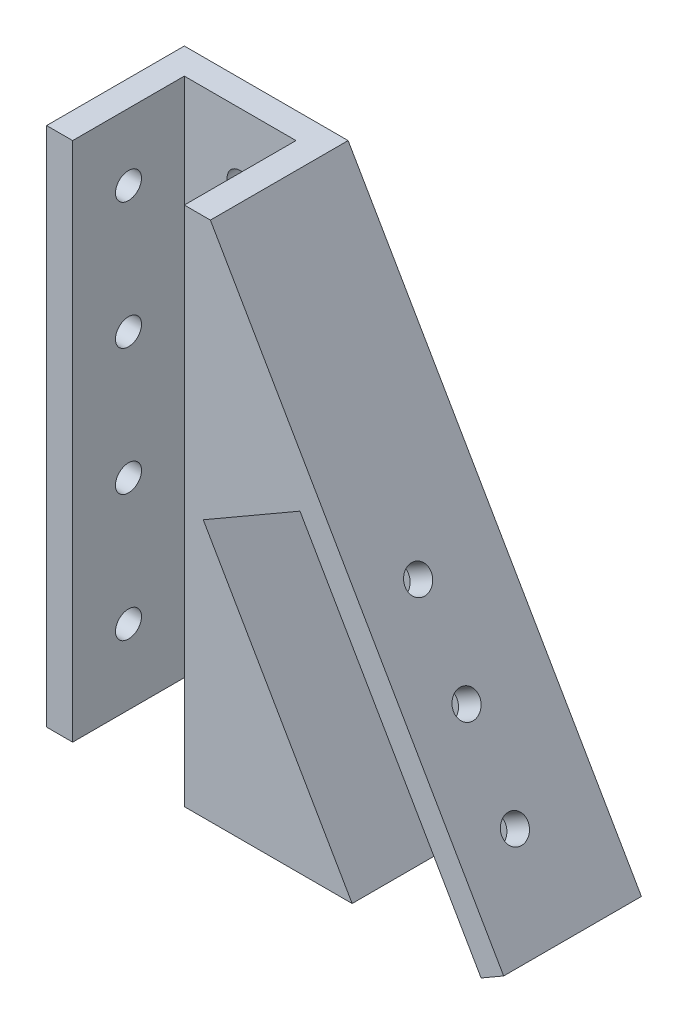
ISO-10303-21;
HEADER;
FILE_DESCRIPTION(('STEP AP214'),'2;1');
FILE_NAME('part.step','',(''),(''),'','','');
FILE_SCHEMA(('AUTOMOTIVE_DESIGN { 1 0 10303 214 1 1 1 1 }'));
ENDSEC;
DATA;
#1=APPLICATION_CONTEXT('core data for automotive mechanical design processes');
#2=APPLICATION_PROTOCOL_DEFINITION('international standard','automotive_design',2000,#1);
#3=PRODUCT_CONTEXT('',#1,'mechanical');
#4=PRODUCT('Part','Part','',(#3));
#5=PRODUCT_RELATED_PRODUCT_CATEGORY('part','',(#4));
#6=PRODUCT_DEFINITION_FORMATION('','',#4);
#7=PRODUCT_DEFINITION_CONTEXT('part definition',#1,'design');
#8=PRODUCT_DEFINITION('design','',#6,#7);
#9=PRODUCT_DEFINITION_SHAPE('','',#8);
#10=(LENGTH_UNIT() NAMED_UNIT(*) SI_UNIT(.MILLI.,.METRE.));
#11=(NAMED_UNIT(*) PLANE_ANGLE_UNIT() SI_UNIT($,.RADIAN.));
#12=(NAMED_UNIT(*) SI_UNIT($,.STERADIAN.) SOLID_ANGLE_UNIT());
#13=UNCERTAINTY_MEASURE_WITH_UNIT(LENGTH_MEASURE(1.E-05),#10,'distance_accuracy_value','');
#14=(GEOMETRIC_REPRESENTATION_CONTEXT(3) GLOBAL_UNCERTAINTY_ASSIGNED_CONTEXT((#13)) GLOBAL_UNIT_ASSIGNED_CONTEXT((#10,
#11,#12)) REPRESENTATION_CONTEXT('',''));
#15=CARTESIAN_POINT('',(0.,0.,0.));
#16=DIRECTION('',(0.,0.,1.));
#17=DIRECTION('',(1.,0.,0.));
#18=AXIS2_PLACEMENT_3D('',#15,#16,#17);
#19=CARTESIAN_POINT('',(0.,0.,18.5));
#20=DIRECTION('',(0.,0.,1.));
#21=DIRECTION('',(1.,0.,0.));
#22=AXIS2_PLACEMENT_3D('',#19,#20,#21);
#23=PLANE('',#22);
#24=DIRECTION('',(0.,-1.,0.));
#25=VECTOR('',#24,1.);
#26=CARTESIAN_POINT('',(-10.6450100198623,37.4695571024635,18.5));
#27=LINE('',#26,#25);
#28=CARTESIAN_POINT('',(-10.6450100198623,37.4695571024635,18.5));
#29=VERTEX_POINT('',#28);
#30=CARTESIAN_POINT('',(-10.6450100198623,-32.5112050110695,18.5));
#31=VERTEX_POINT('',#30);
#32=EDGE_CURVE('E284',#29,#31,#27,.T.);
#33=ORIENTED_EDGE('',*,*,#32,.F.);
#34=DIRECTION('',(-1.,0.,0.));
#35=VECTOR('',#34,1.);
#36=CARTESIAN_POINT('',(-14.1450100198623,37.4695571024635,18.5));
#37=LINE('',#36,#35);
#38=CARTESIAN_POINT('',(-14.1450100198623,37.4695571024635,18.5));
#39=VERTEX_POINT('',#38);
#40=EDGE_CURVE('E148',#29,#39,#37,.T.);
#41=ORIENTED_EDGE('',*,*,#40,.T.);
#42=DIRECTION('',(0.,-1.,0.));
#43=VECTOR('',#42,1.);
#44=CARTESIAN_POINT('',(-14.1450100198623,37.4695571024635,18.5));
#45=LINE('',#44,#43);
#46=CARTESIAN_POINT('',(-14.1450100198623,-32.5112050110695,18.5));
#47=VERTEX_POINT('',#46);
#48=EDGE_CURVE('E170',#39,#47,#45,.T.);
#49=ORIENTED_EDGE('',*,*,#48,.T.);
#50=DIRECTION('',(1.,0.,0.));
#51=VECTOR('',#50,1.);
#52=CARTESIAN_POINT('',(-14.1450100198623,-32.5112050110695,18.5));
#53=LINE('',#52,#51);
#54=EDGE_CURVE('E149',#47,#31,#53,.T.);
#55=ORIENTED_EDGE('',*,*,#54,.T.);
#56=EDGE_LOOP('',(#33,#41,#49,#55));
#57=FACE_BOUND('',#56,.T.);
#58=ADVANCED_FACE('F34',(#57),#23,.T.);
#59=CARTESIAN_POINT('',(-14.1450100198623,37.4695571024635,18.5));
#60=DIRECTION('',(1.,0.,0.));
#61=DIRECTION('',(0.,1.,0.));
#62=AXIS2_PLACEMENT_3D('',#59,#60,#61);
#63=PLANE('',#62);
#64=CARTESIAN_POINT('',(-14.1450100198623,28.4887949889305,11.));
#65=DIRECTION('',(-1.,0.,0.));
#66=DIRECTION('',(0.,-1.,0.));
#67=AXIS2_PLACEMENT_3D('',#64,#65,#66);
#68=CIRCLE('',#67,1.75);
#69=CARTESIAN_POINT('',(-14.1450100198623,26.7387949889305,11.));
#70=VERTEX_POINT('',#69);
#71=EDGE_CURVE('E222',#70,#70,#68,.T.);
#72=ORIENTED_EDGE('',*,*,#71,.F.);
#73=EDGE_LOOP('',(#72));
#74=FACE_BOUND('',#73,.T.);
#75=CARTESIAN_POINT('',(-14.1450100198623,11.4887949889305,11.));
#76=DIRECTION('',(-1.,0.,0.));
#77=DIRECTION('',(0.,-1.,0.));
#78=AXIS2_PLACEMENT_3D('',#75,#76,#77);
#79=CIRCLE('',#78,1.75);
#80=CARTESIAN_POINT('',(-14.1450100198623,9.73879498893051,11.));
#81=VERTEX_POINT('',#80);
#82=EDGE_CURVE('E212',#81,#81,#79,.T.);
#83=ORIENTED_EDGE('',*,*,#82,.F.);
#84=EDGE_LOOP('',(#83));
#85=FACE_BOUND('',#84,.T.);
#86=CARTESIAN_POINT('',(-14.1450100198623,-5.51120501106949,11.));
#87=DIRECTION('',(-1.,0.,0.));
#88=DIRECTION('',(0.,-1.,0.));
#89=AXIS2_PLACEMENT_3D('',#86,#87,#88);
#90=CIRCLE('',#89,1.75);
#91=CARTESIAN_POINT('',(-14.1450100198623,-7.26120501106949,11.));
#92=VERTEX_POINT('',#91);
#93=EDGE_CURVE('E209',#92,#92,#90,.T.);
#94=ORIENTED_EDGE('',*,*,#93,.F.);
#95=EDGE_LOOP('',(#94));
#96=FACE_BOUND('',#95,.T.);
#97=CARTESIAN_POINT('',(-14.1450100198623,-22.5112050110695,11.));
#98=DIRECTION('',(-1.,0.,0.));
#99=DIRECTION('',(0.,-1.,0.));
#100=AXIS2_PLACEMENT_3D('',#97,#98,#99);
#101=CIRCLE('',#100,1.75);
#102=CARTESIAN_POINT('',(-14.1450100198623,-24.2612050110695,11.));
#103=VERTEX_POINT('',#102);
#104=EDGE_CURVE('E206',#103,#103,#101,.T.);
#105=ORIENTED_EDGE('',*,*,#104,.F.);
#106=EDGE_LOOP('',(#105));
#107=FACE_BOUND('',#106,.T.);
#108=DIRECTION('',(0.,-1.,0.));
#109=VECTOR('',#108,1.);
#110=CARTESIAN_POINT('',(-14.1450100198623,37.4695571024635,0.));
#111=LINE('',#110,#109);
#112=CARTESIAN_POINT('',(-14.1450100198623,37.4695571024635,0.));
#113=VERTEX_POINT('',#112);
#114=CARTESIAN_POINT('',(-14.1450100198623,-32.5112050110695,0.));
#115=VERTEX_POINT('',#114);
#116=EDGE_CURVE('E159',#113,#115,#111,.T.);
#117=ORIENTED_EDGE('',*,*,#116,.T.);
#118=DIRECTION('',(0.,0.,-1.));
#119=VECTOR('',#118,1.);
#120=CARTESIAN_POINT('',(-14.1450100198623,-32.5112050110695,18.5));
#121=LINE('',#120,#119);
#122=EDGE_CURVE('E12',#47,#115,#121,.T.);
#123=ORIENTED_EDGE('',*,*,#122,.F.);
#124=ORIENTED_EDGE('',*,*,#48,.F.);
#125=DIRECTION('',(0.,0.,-1.));
#126=VECTOR('',#125,1.);
#127=CARTESIAN_POINT('',(-14.1450100198623,37.4695571024635,18.5));
#128=LINE('',#127,#126);
#129=EDGE_CURVE('E158',#39,#113,#128,.T.);
#130=ORIENTED_EDGE('',*,*,#129,.T.);
#131=EDGE_LOOP('',(#117,#123,#124,#130));
#132=FACE_BOUND('',#131,.T.);
#133=ADVANCED_FACE('F36',(#74,#85,#96,#107,#132),#63,.F.);
#134=CARTESIAN_POINT('',(48.2584018244813,-32.5112050110695,18.5));
#135=DIRECTION('',(0.,1.,0.));
#136=DIRECTION('',(-1.,0.,0.));
#137=AXIS2_PLACEMENT_3D('',#134,#135,#136);
#138=PLANE('',#137);
#139=DIRECTION('',(1.,0.,0.));
#140=VECTOR('',#139,1.);
#141=CARTESIAN_POINT('',(48.2584018244813,-32.5112050110695,0.));
#142=LINE('',#141,#140);
#143=CARTESIAN_POINT('',(44.2169499401539,-32.5112050110695,0.));
#144=VERTEX_POINT('',#143);
#145=EDGE_CURVE('E162',#115,#144,#142,.T.);
#146=ORIENTED_EDGE('',*,*,#145,.T.);
#147=DIRECTION('',(0.,0.,1.));
#148=VECTOR('',#147,1.);
#149=CARTESIAN_POINT('',(44.2169499401539,-32.5112050110695,-0.500000000000004));
#150=LINE('',#149,#148);
#151=CARTESIAN_POINT('',(44.2169499401539,-32.5112050110695,3.5));
#152=VERTEX_POINT('',#151);
#153=EDGE_CURVE('E133',#144,#152,#150,.T.);
#154=ORIENTED_EDGE('',*,*,#153,.T.);
#155=DIRECTION('',(-1.,0.,0.));
#156=VECTOR('',#155,1.);
#157=CARTESIAN_POINT('',(26.8964418644652,-32.5112050110695,3.5));
#158=LINE('',#157,#156);
#159=CARTESIAN_POINT('',(26.8964418644652,-32.5112050110695,3.5));
#160=VERTEX_POINT('',#159);
#161=EDGE_CURVE('E264',#152,#160,#158,.T.);
#162=ORIENTED_EDGE('',*,*,#161,.T.);
#163=DIRECTION('',(0.,0.,1.));
#164=VECTOR('',#163,1.);
#165=CARTESIAN_POINT('',(26.8964418644652,-32.5112050110695,-71.5702945780643));
#166=LINE('',#165,#164);
#167=CARTESIAN_POINT('',(26.8964418644652,-32.5112050110695,18.5));
#168=VERTEX_POINT('',#167);
#169=EDGE_CURVE('E262',#160,#168,#166,.T.);
#170=ORIENTED_EDGE('',*,*,#169,.T.);
#171=CARTESIAN_POINT('',(4.3549899801377,-32.5112050110695,18.5));
#172=VERTEX_POINT('',#171);
#173=EDGE_CURVE('E154',#172,#168,#53,.T.);
#174=ORIENTED_EDGE('',*,*,#173,.F.);
#175=DIRECTION('',(0.,0.,1.));
#176=VECTOR('',#175,1.);
#177=CARTESIAN_POINT('',(4.3549899801377,-32.5112050110695,-71.5702945780643));
#178=LINE('',#177,#176);
#179=CARTESIAN_POINT('',(4.3549899801377,-32.5112050110695,3.5));
#180=VERTEX_POINT('',#179);
#181=EDGE_CURVE('E59',#180,#172,#178,.T.);
#182=ORIENTED_EDGE('',*,*,#181,.F.);
#183=DIRECTION('',(-1.,0.,0.));
#184=VECTOR('',#183,1.);
#185=CARTESIAN_POINT('',(-10.6450100198623,-32.5112050110695,3.5));
#186=LINE('',#185,#184);
#187=CARTESIAN_POINT('',(-10.6450100198623,-32.5112050110695,3.5));
#188=VERTEX_POINT('',#187);
#189=EDGE_CURVE('E163',#180,#188,#186,.T.);
#190=ORIENTED_EDGE('',*,*,#189,.T.);
#191=DIRECTION('',(0.,0.,1.));
#192=VECTOR('',#191,1.);
#193=CARTESIAN_POINT('',(-10.6450100198623,-32.5112050110695,-71.5702945780643));
#194=LINE('',#193,#192);
#195=EDGE_CURVE('E296',#188,#31,#194,.T.);
#196=ORIENTED_EDGE('',*,*,#195,.T.);
#197=ORIENTED_EDGE('',*,*,#54,.F.);
#198=ORIENTED_EDGE('',*,*,#122,.T.);
#199=EDGE_LOOP('',(#146,#154,#162,#170,#174,#182,#190,#196,#197,#198));
#200=FACE_BOUND('',#199,.T.);
#201=ADVANCED_FACE('F313',(#200),#138,.F.);
#202=CARTESIAN_POINT('',(7.85498998013769,37.4695571024635,18.5));
#203=DIRECTION('',(-0.866025403784438,-0.500000000000002,0.));
#204=DIRECTION('',(0.500000000000002,-0.866025403784438,0.));
#205=AXIS2_PLACEMENT_3D('',#202,#203,#204);
#206=PLANE('',#205);
#207=CARTESIAN_POINT('',(28.2584018244813,2.12981114030803,11.));
#208=DIRECTION('',(0.866025403784438,0.500000000000002,0.));
#209=DIRECTION('',(-0.500000000000002,0.866025403784438,0.));
#210=AXIS2_PLACEMENT_3D('',#207,#208,#209);
#211=CIRCLE('',#210,1.75);
#212=CARTESIAN_POINT('',(27.3834018244813,3.64535559693079,11.));
#213=VERTEX_POINT('',#212);
#214=EDGE_CURVE('E177',#213,#213,#211,.T.);
#215=ORIENTED_EDGE('',*,*,#214,.F.);
#216=EDGE_LOOP('',(#215));
#217=FACE_BOUND('',#216,.T.);
#218=CARTESIAN_POINT('',(34.7584018244813,-9.12851910888966,11.));
#219=DIRECTION('',(0.866025403784438,0.500000000000002,0.));
#220=DIRECTION('',(-0.500000000000002,0.866025403784438,0.));
#221=AXIS2_PLACEMENT_3D('',#218,#219,#220);
#222=CIRCLE('',#221,1.75);
#223=CARTESIAN_POINT('',(33.8834018244813,-7.6129746522669,11.));
#224=VERTEX_POINT('',#223);
#225=EDGE_CURVE('E245',#224,#224,#222,.T.);
#226=ORIENTED_EDGE('',*,*,#225,.F.);
#227=EDGE_LOOP('',(#226));
#228=FACE_BOUND('',#227,.T.);
#229=CARTESIAN_POINT('',(41.2584018244813,-20.3868493580874,11.));
#230=DIRECTION('',(0.866025403784438,0.500000000000002,0.));
#231=DIRECTION('',(-0.500000000000002,0.866025403784438,0.));
#232=AXIS2_PLACEMENT_3D('',#229,#230,#231);
#233=CIRCLE('',#232,1.75);
#234=CARTESIAN_POINT('',(40.3834018244813,-18.8713049014646,11.));
#235=VERTEX_POINT('',#234);
#236=EDGE_CURVE('E251',#235,#235,#233,.T.);
#237=ORIENTED_EDGE('',*,*,#236,.F.);
#238=EDGE_LOOP('',(#237));
#239=FACE_BOUND('',#238,.T.);
#240=DIRECTION('',(-0.500000000000002,0.866025403784438,0.));
#241=VECTOR('',#240,1.);
#242=CARTESIAN_POINT('',(7.85498998013769,37.4695571024635,18.5));
#243=LINE('',#242,#241);
#244=CARTESIAN_POINT('',(47.2480388533995,-30.7612050110695,18.5));
#245=VERTEX_POINT('',#244);
#246=CARTESIAN_POINT('',(7.85498998013769,37.4695571024635,18.5));
#247=VERTEX_POINT('',#246);
#248=EDGE_CURVE('E139',#245,#247,#243,.T.);
#249=ORIENTED_EDGE('',*,*,#248,.F.);
#250=DIRECTION('',(0.,0.,1.));
#251=VECTOR('',#250,1.);
#252=CARTESIAN_POINT('',(47.2480388533995,-30.7612050110695,-0.500000000000004));
#253=LINE('',#252,#251);
#254=CARTESIAN_POINT('',(47.2480388533995,-30.7612050110695,0.));
#255=VERTEX_POINT('',#254);
#256=EDGE_CURVE('E126',#255,#245,#253,.T.);
#257=ORIENTED_EDGE('',*,*,#256,.F.);
#258=DIRECTION('',(-0.500000000000002,0.866025403784438,0.));
#259=VECTOR('',#258,1.);
#260=CARTESIAN_POINT('',(7.85498998013769,37.4695571024635,0.));
#261=LINE('',#260,#259);
#262=CARTESIAN_POINT('',(7.85498998013769,37.4695571024635,0.));
#263=VERTEX_POINT('',#262);
#264=EDGE_CURVE('E166',#255,#263,#261,.T.);
#265=ORIENTED_EDGE('',*,*,#264,.T.);
#266=DIRECTION('',(0.,0.,-1.));
#267=VECTOR('',#266,1.);
#268=CARTESIAN_POINT('',(7.85498998013769,37.4695571024635,18.5));
#269=LINE('',#268,#267);
#270=EDGE_CURVE('E43',#247,#263,#269,.T.);
#271=ORIENTED_EDGE('',*,*,#270,.F.);
#272=EDGE_LOOP('',(#249,#257,#265,#271));
#273=FACE_BOUND('',#272,.T.);
#274=ADVANCED_FACE('F145',(#217,#228,#239,#273),#206,.F.);
#275=CARTESIAN_POINT('',(-14.1450100198623,37.4695571024635,18.5));
#276=DIRECTION('',(0.,-1.,0.));
#277=DIRECTION('',(0.,0.,-1.));
#278=AXIS2_PLACEMENT_3D('',#275,#276,#277);
#279=PLANE('',#278);
#280=ORIENTED_EDGE('',*,*,#40,.F.);
#281=DIRECTION('',(0.,0.,1.));
#282=VECTOR('',#281,1.);
#283=CARTESIAN_POINT('',(-10.6450100198623,37.4695571024635,-71.5702945780643));
#284=LINE('',#283,#282);
#285=CARTESIAN_POINT('',(-10.6450100198623,37.4695571024635,3.5));
#286=VERTEX_POINT('',#285);
#287=EDGE_CURVE('E288',#286,#29,#284,.T.);
#288=ORIENTED_EDGE('',*,*,#287,.F.);
#289=DIRECTION('',(1.,0.,0.));
#290=VECTOR('',#289,1.);
#291=CARTESIAN_POINT('',(-10.6450100198623,37.4695571024635,3.5));
#292=LINE('',#291,#290);
#293=CARTESIAN_POINT('',(4.35498998013769,37.4695571024635,3.5));
#294=VERTEX_POINT('',#293);
#295=EDGE_CURVE('E287',#286,#294,#292,.T.);
#296=ORIENTED_EDGE('',*,*,#295,.T.);
#297=DIRECTION('',(0.,0.,1.));
#298=VECTOR('',#297,1.);
#299=CARTESIAN_POINT('',(4.35498998013769,37.4695571024635,-71.5702945780643));
#300=LINE('',#299,#298);
#301=CARTESIAN_POINT('',(4.35498998013769,37.4695571024635,18.5));
#302=VERTEX_POINT('',#301);
#303=EDGE_CURVE('E298',#294,#302,#300,.T.);
#304=ORIENTED_EDGE('',*,*,#303,.T.);
#305=EDGE_CURVE('E151',#247,#302,#37,.T.);
#306=ORIENTED_EDGE('',*,*,#305,.F.);
#307=ORIENTED_EDGE('',*,*,#270,.T.);
#308=DIRECTION('',(-1.,0.,0.));
#309=VECTOR('',#308,1.);
#310=CARTESIAN_POINT('',(-14.1450100198623,37.4695571024635,0.));
#311=LINE('',#310,#309);
#312=EDGE_CURVE('E168',#263,#113,#311,.T.);
#313=ORIENTED_EDGE('',*,*,#312,.T.);
#314=ORIENTED_EDGE('',*,*,#129,.F.);
#315=EDGE_LOOP('',(#280,#288,#296,#304,#306,#307,#313,#314));
#316=FACE_BOUND('',#315,.T.);
#317=ADVANCED_FACE('F352',(#316),#279,.F.);
#318=DIRECTION('',(-0.866025403784438,-0.5,0.));
#319=VECTOR('',#318,1.);
#320=CARTESIAN_POINT('',(44.2169499401539,-32.5112050110695,18.5));
#321=LINE('',#320,#319);
#322=CARTESIAN_POINT('',(44.2169499401539,-32.5112050110695,18.5));
#323=VERTEX_POINT('',#322);
#324=EDGE_CURVE('E51',#245,#323,#321,.T.);
#325=ORIENTED_EDGE('',*,*,#324,.F.);
#326=ORIENTED_EDGE('',*,*,#248,.T.);
#327=ORIENTED_EDGE('',*,*,#305,.T.);
#328=DIRECTION('',(0.,1.,0.));
#329=VECTOR('',#328,1.);
#330=CARTESIAN_POINT('',(4.35498998013769,37.4695571024635,18.5));
#331=LINE('',#330,#329);
#332=EDGE_CURVE('E294',#172,#302,#331,.T.);
#333=ORIENTED_EDGE('',*,*,#332,.F.);
#334=ORIENTED_EDGE('',*,*,#173,.T.);
#335=DIRECTION('',(0.5,-0.866025403784438,0.));
#336=VECTOR('',#335,1.);
#337=CARTESIAN_POINT('',(6.89644186446516,2.12981114030804,18.5));
#338=LINE('',#337,#336);
#339=CARTESIAN_POINT('',(6.89644186446516,2.12981114030804,18.5));
#340=VERTEX_POINT('',#339);
#341=EDGE_CURVE('E272',#340,#168,#338,.T.);
#342=ORIENTED_EDGE('',*,*,#341,.F.);
#343=DIRECTION('',(-0.866025403784438,-0.5,0.));
#344=VECTOR('',#343,1.);
#345=CARTESIAN_POINT('',(19.8868229212317,9.62981114030804,18.5));
#346=LINE('',#345,#344);
#347=CARTESIAN_POINT('',(19.8868229212317,9.62981114030804,18.5));
#348=VERTEX_POINT('',#347);
#349=EDGE_CURVE('E269',#348,#340,#346,.T.);
#350=ORIENTED_EDGE('',*,*,#349,.F.);
#351=DIRECTION('',(-0.5,0.866025403784439,0.));
#352=VECTOR('',#351,1.);
#353=CARTESIAN_POINT('',(44.2169499401539,-32.5112050110695,18.5));
#354=LINE('',#353,#352);
#355=EDGE_CURVE('E143',#323,#348,#354,.T.);
#356=ORIENTED_EDGE('',*,*,#355,.F.);
#357=EDGE_LOOP('',(#325,#326,#327,#333,#334,#342,#350,#356));
#358=FACE_BOUND('',#357,.T.);
#359=ADVANCED_FACE('F137',(#358),#23,.T.);
#360=CARTESIAN_POINT('',(0.,0.,0.));
#361=DIRECTION('',(0.,0.,1.));
#362=DIRECTION('',(1.,0.,0.));
#363=AXIS2_PLACEMENT_3D('',#360,#361,#362);
#364=PLANE('',#363);
#365=CARTESIAN_POINT('',(-3.14501001986232,28.4887949889305,0.));
#366=DIRECTION('',(0.,0.,-1.));
#367=DIRECTION('',(-1.,0.,0.));
#368=AXIS2_PLACEMENT_3D('',#365,#366,#367);
#369=CIRCLE('',#368,1.75);
#370=CARTESIAN_POINT('',(-4.89501001986232,28.4887949889305,0.));
#371=VERTEX_POINT('',#370);
#372=EDGE_CURVE('E202',#371,#371,#369,.T.);
#373=ORIENTED_EDGE('',*,*,#372,.F.);
#374=EDGE_LOOP('',(#373));
#375=FACE_BOUND('',#374,.T.);
#376=CARTESIAN_POINT('',(-3.14501001986231,-22.5112050110695,0.));
#377=DIRECTION('',(0.,0.,-1.));
#378=DIRECTION('',(-1.,0.,0.));
#379=AXIS2_PLACEMENT_3D('',#376,#377,#378);
#380=CIRCLE('',#379,1.75);
#381=CARTESIAN_POINT('',(-4.89501001986231,-22.5112050110695,0.));
#382=VERTEX_POINT('',#381);
#383=EDGE_CURVE('E198',#382,#382,#380,.T.);
#384=ORIENTED_EDGE('',*,*,#383,.F.);
#385=EDGE_LOOP('',(#384));
#386=FACE_BOUND('',#385,.T.);
#387=CARTESIAN_POINT('',(-3.14501001986232,11.4887949889305,0.));
#388=DIRECTION('',(0.,0.,-1.));
#389=DIRECTION('',(-1.,0.,0.));
#390=AXIS2_PLACEMENT_3D('',#387,#388,#389);
#391=CIRCLE('',#390,1.75);
#392=CARTESIAN_POINT('',(-4.89501001986232,11.4887949889305,0.));
#393=VERTEX_POINT('',#392);
#394=EDGE_CURVE('E194',#393,#393,#391,.T.);
#395=ORIENTED_EDGE('',*,*,#394,.F.);
#396=EDGE_LOOP('',(#395));
#397=FACE_BOUND('',#396,.T.);
#398=CARTESIAN_POINT('',(-3.14501001986231,-5.51120501106949,0.));
#399=DIRECTION('',(0.,0.,-1.));
#400=DIRECTION('',(-1.,0.,0.));
#401=AXIS2_PLACEMENT_3D('',#398,#399,#400);
#402=CIRCLE('',#401,1.75);
#403=CARTESIAN_POINT('',(-4.89501001986232,-5.51120501106949,0.));
#404=VERTEX_POINT('',#403);
#405=EDGE_CURVE('E190',#404,#404,#402,.T.);
#406=ORIENTED_EDGE('',*,*,#405,.F.);
#407=EDGE_LOOP('',(#406));
#408=FACE_BOUND('',#407,.T.);
#409=CARTESIAN_POINT('',(17.5566959023095,-1.3342904748297,0.));
#410=DIRECTION('',(0.,0.,-1.));
#411=DIRECTION('',(-1.,0.,0.));
#412=AXIS2_PLACEMENT_3D('',#409,#410,#411);
#413=CIRCLE('',#412,1.75);
#414=CARTESIAN_POINT('',(15.8066959023095,-1.3342904748297,0.));
#415=VERTEX_POINT('',#414);
#416=EDGE_CURVE('E186',#415,#415,#413,.T.);
#417=ORIENTED_EDGE('',*,*,#416,.F.);
#418=EDGE_LOOP('',(#417));
#419=FACE_BOUND('',#418,.T.);
#420=CARTESIAN_POINT('',(24.0566959023096,-12.5926207240274,0.));
#421=DIRECTION('',(0.,0.,-1.));
#422=DIRECTION('',(-1.,0.,0.));
#423=AXIS2_PLACEMENT_3D('',#420,#421,#422);
#424=CIRCLE('',#423,1.75000000000002);
#425=CARTESIAN_POINT('',(22.3066959023095,-12.5926207240274,0.));
#426=VERTEX_POINT('',#425);
#427=EDGE_CURVE('E182',#426,#426,#424,.T.);
#428=ORIENTED_EDGE('',*,*,#427,.F.);
#429=EDGE_LOOP('',(#428));
#430=FACE_BOUND('',#429,.T.);
#431=CARTESIAN_POINT('',(30.5566959023095,-23.8509509732251,0.));
#432=DIRECTION('',(0.,0.,-1.));
#433=DIRECTION('',(-1.,0.,0.));
#434=AXIS2_PLACEMENT_3D('',#431,#432,#433);
#435=CIRCLE('',#434,1.75);
#436=CARTESIAN_POINT('',(28.8066959023095,-23.8509509732251,0.));
#437=VERTEX_POINT('',#436);
#438=EDGE_CURVE('E178',#437,#437,#435,.T.);
#439=ORIENTED_EDGE('',*,*,#438,.F.);
#440=EDGE_LOOP('',(#439));
#441=FACE_BOUND('',#440,.T.);
#442=ORIENTED_EDGE('',*,*,#264,.F.);
#443=DIRECTION('',(-0.866025403784439,-0.5,0.));
#444=VECTOR('',#443,1.);
#445=CARTESIAN_POINT('',(25.1320022086536,-43.5299047213212,0.));
#446=LINE('',#445,#444);
#447=EDGE_CURVE('E129',#255,#144,#446,.T.);
#448=ORIENTED_EDGE('',*,*,#447,.T.);
#449=ORIENTED_EDGE('',*,*,#145,.F.);
#450=ORIENTED_EDGE('',*,*,#116,.F.);
#451=ORIENTED_EDGE('',*,*,#312,.F.);
#452=EDGE_LOOP('',(#442,#448,#449,#450,#451));
#453=FACE_BOUND('',#452,.T.);
#454=ADVANCED_FACE('F345',(#375,#386,#397,#408,#419,#430,#441,#453),#364,.F.);
#455=CARTESIAN_POINT('',(-10.6450100198623,37.4695571024635,-71.5702945780643));
#456=DIRECTION('',(-1.,0.,0.));
#457=DIRECTION('',(0.,-1.,0.));
#458=AXIS2_PLACEMENT_3D('',#455,#456,#457);
#459=PLANE('',#458);
#460=CARTESIAN_POINT('',(-10.6450100198623,28.4887949889305,11.));
#461=DIRECTION('',(-1.,0.,0.));
#462=DIRECTION('',(0.,-1.,0.));
#463=AXIS2_PLACEMENT_3D('',#460,#461,#462);
#464=CIRCLE('',#463,1.75);
#465=CARTESIAN_POINT('',(-10.6450100198623,26.7387949889305,11.));
#466=VERTEX_POINT('',#465);
#467=EDGE_CURVE('E38',#466,#466,#464,.T.);
#468=ORIENTED_EDGE('',*,*,#467,.T.);
#469=EDGE_LOOP('',(#468));
#470=FACE_BOUND('',#469,.T.);
#471=CARTESIAN_POINT('',(-10.6450100198623,11.4887949889305,11.));
#472=DIRECTION('',(-1.,0.,0.));
#473=DIRECTION('',(0.,-1.,0.));
#474=AXIS2_PLACEMENT_3D('',#471,#472,#473);
#475=CIRCLE('',#474,1.75);
#476=CARTESIAN_POINT('',(-10.6450100198623,9.73879498893051,11.));
#477=VERTEX_POINT('',#476);
#478=EDGE_CURVE('E210',#477,#477,#475,.T.);
#479=ORIENTED_EDGE('',*,*,#478,.T.);
#480=EDGE_LOOP('',(#479));
#481=FACE_BOUND('',#480,.T.);
#482=CARTESIAN_POINT('',(-10.6450100198623,-5.51120501106949,11.));
#483=DIRECTION('',(-1.,0.,0.));
#484=DIRECTION('',(0.,-1.,0.));
#485=AXIS2_PLACEMENT_3D('',#482,#483,#484);
#486=CIRCLE('',#485,1.75);
#487=CARTESIAN_POINT('',(-10.6450100198623,-7.26120501106949,11.));
#488=VERTEX_POINT('',#487);
#489=EDGE_CURVE('E207',#488,#488,#486,.T.);
#490=ORIENTED_EDGE('',*,*,#489,.T.);
#491=EDGE_LOOP('',(#490));
#492=FACE_BOUND('',#491,.T.);
#493=CARTESIAN_POINT('',(-10.6450100198623,-22.5112050110695,11.));
#494=DIRECTION('',(-1.,0.,0.));
#495=DIRECTION('',(0.,-1.,0.));
#496=AXIS2_PLACEMENT_3D('',#493,#494,#495);
#497=CIRCLE('',#496,1.75);
#498=CARTESIAN_POINT('',(-10.6450100198623,-24.2612050110695,11.));
#499=VERTEX_POINT('',#498);
#500=EDGE_CURVE('E203',#499,#499,#497,.T.);
#501=ORIENTED_EDGE('',*,*,#500,.T.);
#502=EDGE_LOOP('',(#501));
#503=FACE_BOUND('',#502,.T.);
#504=DIRECTION('',(0.,1.,0.));
#505=VECTOR('',#504,1.);
#506=CARTESIAN_POINT('',(-10.6450100198623,37.4695571024635,3.5));
#507=LINE('',#506,#505);
#508=EDGE_CURVE('E291',#188,#286,#507,.T.);
#509=ORIENTED_EDGE('',*,*,#508,.T.);
#510=ORIENTED_EDGE('',*,*,#287,.T.);
#511=ORIENTED_EDGE('',*,*,#32,.T.);
#512=ORIENTED_EDGE('',*,*,#195,.F.);
#513=EDGE_LOOP('',(#509,#510,#511,#512));
#514=FACE_BOUND('',#513,.T.);
#515=ADVANCED_FACE('F359',(#470,#481,#492,#503,#514),#459,.F.);
#516=CARTESIAN_POINT('',(4.35498998013769,37.4695571024635,-71.5702945780643));
#517=DIRECTION('',(1.,0.,0.));
#518=DIRECTION('',(0.,1.,0.));
#519=AXIS2_PLACEMENT_3D('',#516,#517,#518);
#520=PLANE('',#519);
#521=DIRECTION('',(0.,-1.,0.));
#522=VECTOR('',#521,1.);
#523=CARTESIAN_POINT('',(4.35498998013769,37.4695571024635,3.5));
#524=LINE('',#523,#522);
#525=EDGE_CURVE('E285',#294,#180,#524,.T.);
#526=ORIENTED_EDGE('',*,*,#525,.T.);
#527=ORIENTED_EDGE('',*,*,#181,.T.);
#528=ORIENTED_EDGE('',*,*,#332,.T.);
#529=ORIENTED_EDGE('',*,*,#303,.F.);
#530=EDGE_LOOP('',(#526,#527,#528,#529));
#531=FACE_BOUND('',#530,.T.);
#532=ADVANCED_FACE('F355',(#531),#520,.F.);
#533=CARTESIAN_POINT('',(0.,0.,3.5));
#534=DIRECTION('',(0.,0.,1.));
#535=DIRECTION('',(1.,0.,0.));
#536=AXIS2_PLACEMENT_3D('',#533,#534,#535);
#537=PLANE('',#536);
#538=CARTESIAN_POINT('',(-3.14501001986232,28.4887949889305,3.5));
#539=DIRECTION('',(0.,0.,1.));
#540=DIRECTION('',(1.,0.,0.));
#541=AXIS2_PLACEMENT_3D('',#538,#539,#540);
#542=CIRCLE('',#541,1.75);
#543=CARTESIAN_POINT('',(-1.39501001986232,28.4887949889305,3.5));
#544=VERTEX_POINT('',#543);
#545=EDGE_CURVE('E199',#544,#544,#542,.T.);
#546=ORIENTED_EDGE('',*,*,#545,.F.);
#547=EDGE_LOOP('',(#546));
#548=FACE_BOUND('',#547,.T.);
#549=CARTESIAN_POINT('',(-3.14501001986231,-22.5112050110695,3.5));
#550=DIRECTION('',(0.,0.,1.));
#551=DIRECTION('',(1.,0.,0.));
#552=AXIS2_PLACEMENT_3D('',#549,#550,#551);
#553=CIRCLE('',#552,1.75);
#554=CARTESIAN_POINT('',(-1.39501001986231,-22.5112050110695,3.5));
#555=VERTEX_POINT('',#554);
#556=EDGE_CURVE('E195',#555,#555,#553,.T.);
#557=ORIENTED_EDGE('',*,*,#556,.F.);
#558=EDGE_LOOP('',(#557));
#559=FACE_BOUND('',#558,.T.);
#560=CARTESIAN_POINT('',(-3.14501001986232,11.4887949889305,3.5));
#561=DIRECTION('',(0.,0.,1.));
#562=DIRECTION('',(1.,0.,0.));
#563=AXIS2_PLACEMENT_3D('',#560,#561,#562);
#564=CIRCLE('',#563,1.75);
#565=CARTESIAN_POINT('',(-1.39501001986232,11.4887949889305,3.5));
#566=VERTEX_POINT('',#565);
#567=EDGE_CURVE('E191',#566,#566,#564,.T.);
#568=ORIENTED_EDGE('',*,*,#567,.F.);
#569=EDGE_LOOP('',(#568));
#570=FACE_BOUND('',#569,.T.);
#571=CARTESIAN_POINT('',(-3.14501001986231,-5.51120501106949,3.5));
#572=DIRECTION('',(0.,0.,1.));
#573=DIRECTION('',(1.,0.,0.));
#574=AXIS2_PLACEMENT_3D('',#571,#572,#573);
#575=CIRCLE('',#574,1.75);
#576=CARTESIAN_POINT('',(-1.39501001986231,-5.51120501106949,3.5));
#577=VERTEX_POINT('',#576);
#578=EDGE_CURVE('E187',#577,#577,#575,.T.);
#579=ORIENTED_EDGE('',*,*,#578,.F.);
#580=EDGE_LOOP('',(#579));
#581=FACE_BOUND('',#580,.T.);
#582=ORIENTED_EDGE('',*,*,#508,.F.);
#583=ORIENTED_EDGE('',*,*,#189,.F.);
#584=ORIENTED_EDGE('',*,*,#525,.F.);
#585=ORIENTED_EDGE('',*,*,#295,.F.);
#586=EDGE_LOOP('',(#582,#583,#584,#585));
#587=FACE_BOUND('',#586,.T.);
#588=ADVANCED_FACE('F358',(#548,#559,#570,#581,#587),#537,.T.);
#589=CARTESIAN_POINT('',(6.89644186446516,2.12981114030804,-71.5702945780643));
#590=DIRECTION('',(-0.866025403784438,-0.5,0.));
#591=DIRECTION('',(0.5,-0.866025403784438,0.));
#592=AXIS2_PLACEMENT_3D('',#589,#590,#591);
#593=PLANE('',#592);
#594=DIRECTION('',(-0.5,0.866025403784438,0.));
#595=VECTOR('',#594,1.);
#596=CARTESIAN_POINT('',(6.89644186446516,2.12981114030804,3.5));
#597=LINE('',#596,#595);
#598=CARTESIAN_POINT('',(6.89644186446517,2.12981114030804,3.5));
#599=VERTEX_POINT('',#598);
#600=EDGE_CURVE('E261',#160,#599,#597,.T.);
#601=ORIENTED_EDGE('',*,*,#600,.T.);
#602=DIRECTION('',(0.,0.,1.));
#603=VECTOR('',#602,1.);
#604=CARTESIAN_POINT('',(6.89644186446516,2.12981114030804,-71.5702945780643));
#605=LINE('',#604,#603);
#606=EDGE_CURVE('E277',#599,#340,#605,.T.);
#607=ORIENTED_EDGE('',*,*,#606,.T.);
#608=ORIENTED_EDGE('',*,*,#341,.T.);
#609=ORIENTED_EDGE('',*,*,#169,.F.);
#610=EDGE_LOOP('',(#601,#607,#608,#609));
#611=FACE_BOUND('',#610,.T.);
#612=ADVANCED_FACE('F318',(#611),#593,.F.);
#613=CARTESIAN_POINT('',(19.8868229212317,9.62981114030804,-71.5702945780643));
#614=DIRECTION('',(-0.5,0.866025403784438,0.));
#615=DIRECTION('',(-0.866025403784439,-0.5,0.));
#616=AXIS2_PLACEMENT_3D('',#613,#614,#615);
#617=PLANE('',#616);
#618=DIRECTION('',(0.866025403784439,0.5,0.));
#619=VECTOR('',#618,1.);
#620=CARTESIAN_POINT('',(19.8868229212317,9.62981114030804,3.5));
#621=LINE('',#620,#619);
#622=CARTESIAN_POINT('',(19.8868229212317,9.62981114030804,3.5));
#623=VERTEX_POINT('',#622);
#624=EDGE_CURVE('E259',#599,#623,#621,.T.);
#625=ORIENTED_EDGE('',*,*,#624,.T.);
#626=DIRECTION('',(0.,0.,1.));
#627=VECTOR('',#626,1.);
#628=CARTESIAN_POINT('',(19.8868229212317,9.62981114030804,-71.5702945780643));
#629=LINE('',#628,#627);
#630=EDGE_CURVE('E279',#623,#348,#629,.T.);
#631=ORIENTED_EDGE('',*,*,#630,.T.);
#632=ORIENTED_EDGE('',*,*,#349,.T.);
#633=ORIENTED_EDGE('',*,*,#606,.F.);
#634=EDGE_LOOP('',(#625,#631,#632,#633));
#635=FACE_BOUND('',#634,.T.);
#636=ADVANCED_FACE('F322',(#635),#617,.F.);
#637=CARTESIAN_POINT('',(44.2169499401539,-32.5112050110695,-71.5702945780643));
#638=DIRECTION('',(0.866025403784439,0.5,0.));
#639=DIRECTION('',(-0.5,0.866025403784439,0.));
#640=AXIS2_PLACEMENT_3D('',#637,#638,#639);
#641=PLANE('',#640);
#642=CARTESIAN_POINT('',(25.2273129112357,0.379811140308022,11.));
#643=DIRECTION('',(0.866025403784438,0.500000000000002,0.));
#644=DIRECTION('',(-0.500000000000002,0.866025403784438,0.));
#645=AXIS2_PLACEMENT_3D('',#642,#643,#644);
#646=CIRCLE('',#645,1.75);
#647=CARTESIAN_POINT('',(24.3523129112357,1.89535559693079,11.));
#648=VERTEX_POINT('',#647);
#649=EDGE_CURVE('E242',#648,#648,#646,.T.);
#650=ORIENTED_EDGE('',*,*,#649,.T.);
#651=EDGE_LOOP('',(#650));
#652=FACE_BOUND('',#651,.T.);
#653=CARTESIAN_POINT('',(31.7273129112357,-10.8785191088897,11.));
#654=DIRECTION('',(0.866025403784438,0.500000000000002,0.));
#655=DIRECTION('',(-0.500000000000002,0.866025403784438,0.));
#656=AXIS2_PLACEMENT_3D('',#653,#654,#655);
#657=CIRCLE('',#656,1.75);
#658=CARTESIAN_POINT('',(30.8523129112357,-9.3629746522669,11.));
#659=VERTEX_POINT('',#658);
#660=EDGE_CURVE('E248',#659,#659,#657,.T.);
#661=ORIENTED_EDGE('',*,*,#660,.T.);
#662=EDGE_LOOP('',(#661));
#663=FACE_BOUND('',#662,.T.);
#664=CARTESIAN_POINT('',(38.2273129112358,-22.1368493580874,11.));
#665=DIRECTION('',(0.866025403784438,0.500000000000002,0.));
#666=DIRECTION('',(-0.500000000000002,0.866025403784438,0.));
#667=AXIS2_PLACEMENT_3D('',#664,#665,#666);
#668=CIRCLE('',#667,1.75);
#669=CARTESIAN_POINT('',(37.3523129112358,-20.6213049014646,11.));
#670=VERTEX_POINT('',#669);
#671=EDGE_CURVE('E254',#670,#670,#668,.T.);
#672=ORIENTED_EDGE('',*,*,#671,.T.);
#673=EDGE_LOOP('',(#672));
#674=FACE_BOUND('',#673,.T.);
#675=DIRECTION('',(0.5,-0.866025403784439,0.));
#676=VECTOR('',#675,1.);
#677=CARTESIAN_POINT('',(44.2169499401539,-32.5112050110695,3.5));
#678=LINE('',#677,#676);
#679=EDGE_CURVE('E267',#623,#152,#678,.T.);
#680=ORIENTED_EDGE('',*,*,#679,.T.);
#681=DIRECTION('',(0.,0.,1.));
#682=VECTOR('',#681,1.);
#683=CARTESIAN_POINT('',(44.2169499401539,-32.5112050110695,-71.5702945780643));
#684=LINE('',#683,#682);
#685=EDGE_CURVE('E274',#152,#323,#684,.T.);
#686=ORIENTED_EDGE('',*,*,#685,.T.);
#687=ORIENTED_EDGE('',*,*,#355,.T.);
#688=ORIENTED_EDGE('',*,*,#630,.F.);
#689=EDGE_LOOP('',(#680,#686,#687,#688));
#690=FACE_BOUND('',#689,.T.);
#691=ADVANCED_FACE('F326',(#652,#663,#674,#690),#641,.F.);
#692=CARTESIAN_POINT('',(0.,0.,3.5));
#693=DIRECTION('',(0.,0.,1.));
#694=DIRECTION('',(1.,0.,0.));
#695=AXIS2_PLACEMENT_3D('',#692,#693,#694);
#696=PLANE('',#695);
#697=CARTESIAN_POINT('',(17.5566959023095,-1.3342904748297,3.5));
#698=DIRECTION('',(0.,0.,1.));
#699=DIRECTION('',(1.,0.,0.));
#700=AXIS2_PLACEMENT_3D('',#697,#698,#699);
#701=CIRCLE('',#700,1.75);
#702=CARTESIAN_POINT('',(19.3066959023095,-1.3342904748297,3.5));
#703=VERTEX_POINT('',#702);
#704=EDGE_CURVE('E183',#703,#703,#701,.T.);
#705=ORIENTED_EDGE('',*,*,#704,.F.);
#706=EDGE_LOOP('',(#705));
#707=FACE_BOUND('',#706,.T.);
#708=CARTESIAN_POINT('',(24.0566959023096,-12.5926207240274,3.5));
#709=DIRECTION('',(0.,0.,1.));
#710=DIRECTION('',(1.,0.,0.));
#711=AXIS2_PLACEMENT_3D('',#708,#709,#710);
#712=CIRCLE('',#711,1.75000000000002);
#713=CARTESIAN_POINT('',(25.8066959023096,-12.5926207240274,3.5));
#714=VERTEX_POINT('',#713);
#715=EDGE_CURVE('E179',#714,#714,#712,.T.);
#716=ORIENTED_EDGE('',*,*,#715,.F.);
#717=EDGE_LOOP('',(#716));
#718=FACE_BOUND('',#717,.T.);
#719=CARTESIAN_POINT('',(30.5566959023095,-23.8509509732251,3.5));
#720=DIRECTION('',(0.,0.,1.));
#721=DIRECTION('',(1.,0.,0.));
#722=AXIS2_PLACEMENT_3D('',#719,#720,#721);
#723=CIRCLE('',#722,1.75);
#724=CARTESIAN_POINT('',(32.3066959023095,-23.8509509732251,3.5));
#725=VERTEX_POINT('',#724);
#726=EDGE_CURVE('E174',#725,#725,#723,.T.);
#727=ORIENTED_EDGE('',*,*,#726,.F.);
#728=EDGE_LOOP('',(#727));
#729=FACE_BOUND('',#728,.T.);
#730=ORIENTED_EDGE('',*,*,#161,.F.);
#731=ORIENTED_EDGE('',*,*,#679,.F.);
#732=ORIENTED_EDGE('',*,*,#624,.F.);
#733=ORIENTED_EDGE('',*,*,#600,.F.);
#734=EDGE_LOOP('',(#730,#731,#732,#733));
#735=FACE_BOUND('',#734,.T.);
#736=ADVANCED_FACE('F415',(#707,#718,#729,#735),#696,.T.);
#737=CARTESIAN_POINT('',(38.2273129112358,-22.1368493580874,11.));
#738=DIRECTION('',(0.866025403784438,0.500000000000002,0.));
#739=DIRECTION('',(-0.500000000000001,0.866025403784438,0.));
#740=AXIS2_PLACEMENT_3D('',#737,#738,#739);
#741=CYLINDRICAL_SURFACE('',#740,1.75);
#742=ORIENTED_EDGE('',*,*,#671,.F.);
#743=EDGE_LOOP('',(#742));
#744=FACE_BOUND('',#743,.T.);
#745=ORIENTED_EDGE('',*,*,#236,.T.);
#746=EDGE_LOOP('',(#745));
#747=FACE_BOUND('',#746,.T.);
#748=ADVANCED_FACE('F427',(#744,#747),#741,.F.);
#749=CARTESIAN_POINT('',(31.7273129112357,-10.8785191088897,11.));
#750=DIRECTION('',(0.866025403784438,0.500000000000002,0.));
#751=DIRECTION('',(-0.500000000000001,0.866025403784438,0.));
#752=AXIS2_PLACEMENT_3D('',#749,#750,#751);
#753=CYLINDRICAL_SURFACE('',#752,1.75);
#754=ORIENTED_EDGE('',*,*,#660,.F.);
#755=EDGE_LOOP('',(#754));
#756=FACE_BOUND('',#755,.T.);
#757=ORIENTED_EDGE('',*,*,#225,.T.);
#758=EDGE_LOOP('',(#757));
#759=FACE_BOUND('',#758,.T.);
#760=ADVANCED_FACE('F532',(#756,#759),#753,.F.);
#761=CARTESIAN_POINT('',(25.2273129112357,0.379811140308022,11.));
#762=DIRECTION('',(0.866025403784438,0.500000000000002,0.));
#763=DIRECTION('',(-0.500000000000001,0.866025403784438,0.));
#764=AXIS2_PLACEMENT_3D('',#761,#762,#763);
#765=CYLINDRICAL_SURFACE('',#764,1.75);
#766=ORIENTED_EDGE('',*,*,#649,.F.);
#767=EDGE_LOOP('',(#766));
#768=FACE_BOUND('',#767,.T.);
#769=ORIENTED_EDGE('',*,*,#214,.T.);
#770=EDGE_LOOP('',(#769));
#771=FACE_BOUND('',#770,.T.);
#772=ADVANCED_FACE('F523',(#768,#771),#765,.F.);
#773=CARTESIAN_POINT('',(30.5566959023095,-23.8509509732251,4.));
#774=DIRECTION('',(0.,0.,-1.));
#775=DIRECTION('',(-1.,0.,0.));
#776=AXIS2_PLACEMENT_3D('',#773,#774,#775);
#777=CYLINDRICAL_SURFACE('',#776,1.75);
#778=ORIENTED_EDGE('',*,*,#726,.T.);
#779=EDGE_LOOP('',(#778));
#780=FACE_BOUND('',#779,.T.);
#781=ORIENTED_EDGE('',*,*,#438,.T.);
#782=EDGE_LOOP('',(#781));
#783=FACE_BOUND('',#782,.T.);
#784=ADVANCED_FACE('F515',(#780,#783),#777,.F.);
#785=CARTESIAN_POINT('',(24.0566959023096,-12.5926207240274,4.));
#786=DIRECTION('',(0.,0.,-1.));
#787=DIRECTION('',(-1.,0.,0.));
#788=AXIS2_PLACEMENT_3D('',#785,#786,#787);
#789=CYLINDRICAL_SURFACE('',#788,1.75000000000002);
#790=ORIENTED_EDGE('',*,*,#715,.T.);
#791=EDGE_LOOP('',(#790));
#792=FACE_BOUND('',#791,.T.);
#793=ORIENTED_EDGE('',*,*,#427,.T.);
#794=EDGE_LOOP('',(#793));
#795=FACE_BOUND('',#794,.T.);
#796=ADVANCED_FACE('F507',(#792,#795),#789,.F.);
#797=CARTESIAN_POINT('',(17.5566959023095,-1.3342904748297,4.));
#798=DIRECTION('',(0.,0.,-1.));
#799=DIRECTION('',(-1.,0.,0.));
#800=AXIS2_PLACEMENT_3D('',#797,#798,#799);
#801=CYLINDRICAL_SURFACE('',#800,1.75);
#802=ORIENTED_EDGE('',*,*,#704,.T.);
#803=EDGE_LOOP('',(#802));
#804=FACE_BOUND('',#803,.T.);
#805=ORIENTED_EDGE('',*,*,#416,.T.);
#806=EDGE_LOOP('',(#805));
#807=FACE_BOUND('',#806,.T.);
#808=ADVANCED_FACE('F499',(#804,#807),#801,.F.);
#809=CARTESIAN_POINT('',(-3.14501001986231,-5.51120501106949,4.));
#810=DIRECTION('',(0.,0.,-1.));
#811=DIRECTION('',(-1.,0.,0.));
#812=AXIS2_PLACEMENT_3D('',#809,#810,#811);
#813=CYLINDRICAL_SURFACE('',#812,1.75);
#814=ORIENTED_EDGE('',*,*,#578,.T.);
#815=EDGE_LOOP('',(#814));
#816=FACE_BOUND('',#815,.T.);
#817=ORIENTED_EDGE('',*,*,#405,.T.);
#818=EDGE_LOOP('',(#817));
#819=FACE_BOUND('',#818,.T.);
#820=ADVANCED_FACE('F491',(#816,#819),#813,.F.);
#821=CARTESIAN_POINT('',(-3.14501001986232,11.4887949889305,4.));
#822=DIRECTION('',(0.,0.,-1.));
#823=DIRECTION('',(-1.,0.,0.));
#824=AXIS2_PLACEMENT_3D('',#821,#822,#823);
#825=CYLINDRICAL_SURFACE('',#824,1.75);
#826=ORIENTED_EDGE('',*,*,#567,.T.);
#827=EDGE_LOOP('',(#826));
#828=FACE_BOUND('',#827,.T.);
#829=ORIENTED_EDGE('',*,*,#394,.T.);
#830=EDGE_LOOP('',(#829));
#831=FACE_BOUND('',#830,.T.);
#832=ADVANCED_FACE('F483',(#828,#831),#825,.F.);
#833=CARTESIAN_POINT('',(-3.14501001986231,-22.5112050110695,4.));
#834=DIRECTION('',(0.,0.,-1.));
#835=DIRECTION('',(-1.,0.,0.));
#836=AXIS2_PLACEMENT_3D('',#833,#834,#835);
#837=CYLINDRICAL_SURFACE('',#836,1.75);
#838=ORIENTED_EDGE('',*,*,#556,.T.);
#839=EDGE_LOOP('',(#838));
#840=FACE_BOUND('',#839,.T.);
#841=ORIENTED_EDGE('',*,*,#383,.T.);
#842=EDGE_LOOP('',(#841));
#843=FACE_BOUND('',#842,.T.);
#844=ADVANCED_FACE('F475',(#840,#843),#837,.F.);
#845=CARTESIAN_POINT('',(-3.14501001986232,28.4887949889305,4.));
#846=DIRECTION('',(0.,0.,-1.));
#847=DIRECTION('',(-1.,0.,0.));
#848=AXIS2_PLACEMENT_3D('',#845,#846,#847);
#849=CYLINDRICAL_SURFACE('',#848,1.75);
#850=ORIENTED_EDGE('',*,*,#545,.T.);
#851=EDGE_LOOP('',(#850));
#852=FACE_BOUND('',#851,.T.);
#853=ORIENTED_EDGE('',*,*,#372,.T.);
#854=EDGE_LOOP('',(#853));
#855=FACE_BOUND('',#854,.T.);
#856=ADVANCED_FACE('F467',(#852,#855),#849,.F.);
#857=CARTESIAN_POINT('',(-10.1450100198623,-22.5112050110695,11.));
#858=DIRECTION('',(-1.,0.,0.));
#859=DIRECTION('',(0.,-1.,0.));
#860=AXIS2_PLACEMENT_3D('',#857,#858,#859);
#861=CYLINDRICAL_SURFACE('',#860,1.75);
#862=ORIENTED_EDGE('',*,*,#104,.T.);
#863=EDGE_LOOP('',(#862));
#864=FACE_BOUND('',#863,.T.);
#865=ORIENTED_EDGE('',*,*,#500,.F.);
#866=EDGE_LOOP('',(#865));
#867=FACE_BOUND('',#866,.T.);
#868=ADVANCED_FACE('F459',(#864,#867),#861,.F.);
#869=CARTESIAN_POINT('',(-10.1450100198623,-5.51120501106949,11.));
#870=DIRECTION('',(-1.,0.,0.));
#871=DIRECTION('',(0.,-1.,0.));
#872=AXIS2_PLACEMENT_3D('',#869,#870,#871);
#873=CYLINDRICAL_SURFACE('',#872,1.75);
#874=ORIENTED_EDGE('',*,*,#93,.T.);
#875=EDGE_LOOP('',(#874));
#876=FACE_BOUND('',#875,.T.);
#877=ORIENTED_EDGE('',*,*,#489,.F.);
#878=EDGE_LOOP('',(#877));
#879=FACE_BOUND('',#878,.T.);
#880=ADVANCED_FACE('F452',(#876,#879),#873,.F.);
#881=CARTESIAN_POINT('',(-10.1450100198623,11.4887949889305,11.));
#882=DIRECTION('',(-1.,0.,0.));
#883=DIRECTION('',(0.,-1.,0.));
#884=AXIS2_PLACEMENT_3D('',#881,#882,#883);
#885=CYLINDRICAL_SURFACE('',#884,1.75);
#886=ORIENTED_EDGE('',*,*,#82,.T.);
#887=EDGE_LOOP('',(#886));
#888=FACE_BOUND('',#887,.T.);
#889=ORIENTED_EDGE('',*,*,#478,.F.);
#890=EDGE_LOOP('',(#889));
#891=FACE_BOUND('',#890,.T.);
#892=ADVANCED_FACE('F446',(#888,#891),#885,.F.);
#893=CARTESIAN_POINT('',(-10.1450100198623,28.4887949889305,11.));
#894=DIRECTION('',(-1.,0.,0.));
#895=DIRECTION('',(0.,-1.,0.));
#896=AXIS2_PLACEMENT_3D('',#893,#894,#895);
#897=CYLINDRICAL_SURFACE('',#896,1.75);
#898=ORIENTED_EDGE('',*,*,#71,.T.);
#899=EDGE_LOOP('',(#898));
#900=FACE_BOUND('',#899,.T.);
#901=ORIENTED_EDGE('',*,*,#467,.F.);
#902=EDGE_LOOP('',(#901));
#903=FACE_BOUND('',#902,.T.);
#904=ADVANCED_FACE('F332',(#900,#903),#897,.F.);
#905=CARTESIAN_POINT('',(44.2169499401539,-32.5112050110695,-0.500000000000004));
#906=DIRECTION('',(-0.5,0.866025403784438,0.));
#907=DIRECTION('',(-0.866025403784439,-0.5,0.));
#908=AXIS2_PLACEMENT_3D('',#905,#906,#907);
#909=PLANE('',#908);
#910=ORIENTED_EDGE('',*,*,#256,.T.);
#911=ORIENTED_EDGE('',*,*,#324,.T.);
#912=ORIENTED_EDGE('',*,*,#685,.F.);
#913=ORIENTED_EDGE('',*,*,#153,.F.);
#914=ORIENTED_EDGE('',*,*,#447,.F.);
#915=EDGE_LOOP('',(#910,#911,#912,#913,#914));
#916=FACE_BOUND('',#915,.T.);
#917=ADVANCED_FACE('F127',(#916),#909,.F.);
#918=CLOSED_SHELL('',(#58,#133,#201,#274,#317,#359,#454,#515,#532,#588,#612,#636,#691,#736,#748,
#760,#772,#784,#796,#808,#820,#832,#844,#856,#868,#880,#892,#904,#917));
#919=MANIFOLD_SOLID_BREP('B2',#918);
#920=ADVANCED_BREP_SHAPE_REPRESENTATION('',(#18,#919),#14);
#921=SHAPE_DEFINITION_REPRESENTATION(#9,#920);
ENDSEC;
END-ISO-10303-21;
